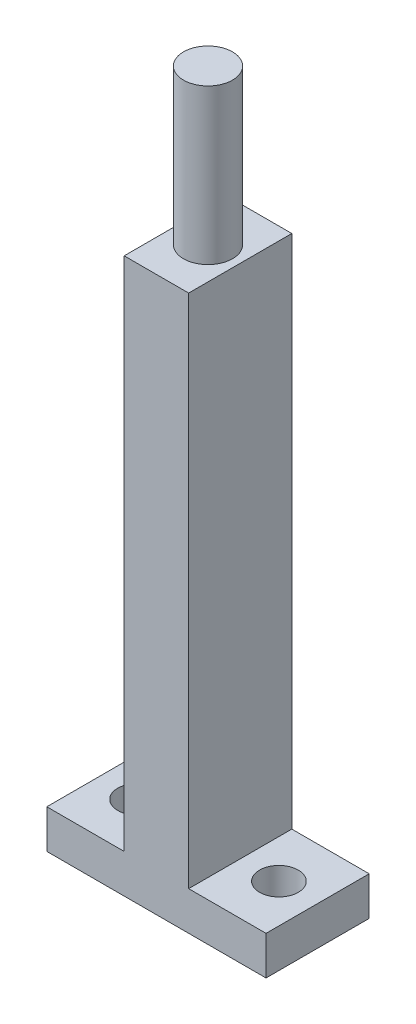
ISO-10303-21;
HEADER;
FILE_DESCRIPTION(('STEP AP214'),'2;1');
FILE_NAME('part.step','',(''),(''),'','','');
FILE_SCHEMA(('AUTOMOTIVE_DESIGN { 1 0 10303 214 1 1 1 1 }'));
ENDSEC;
DATA;
#1=APPLICATION_CONTEXT('core data for automotive mechanical design processes');
#2=APPLICATION_PROTOCOL_DEFINITION('international standard','automotive_design',2000,#1);
#3=PRODUCT_CONTEXT('',#1,'mechanical');
#4=PRODUCT('Part','Part','',(#3));
#5=PRODUCT_RELATED_PRODUCT_CATEGORY('part','',(#4));
#6=PRODUCT_DEFINITION_FORMATION('','',#4);
#7=PRODUCT_DEFINITION_CONTEXT('part definition',#1,'design');
#8=PRODUCT_DEFINITION('design','',#6,#7);
#9=PRODUCT_DEFINITION_SHAPE('','',#8);
#10=(LENGTH_UNIT() NAMED_UNIT(*) SI_UNIT(.MILLI.,.METRE.));
#11=(NAMED_UNIT(*) PLANE_ANGLE_UNIT() SI_UNIT($,.RADIAN.));
#12=(NAMED_UNIT(*) SI_UNIT($,.STERADIAN.) SOLID_ANGLE_UNIT());
#13=UNCERTAINTY_MEASURE_WITH_UNIT(LENGTH_MEASURE(1.E-05),#10,'distance_accuracy_value','');
#14=(GEOMETRIC_REPRESENTATION_CONTEXT(3) GLOBAL_UNCERTAINTY_ASSIGNED_CONTEXT((#13)) GLOBAL_UNIT_ASSIGNED_CONTEXT((#10,
#11,#12)) REPRESENTATION_CONTEXT('',''));
#15=CARTESIAN_POINT('',(0.,0.,0.));
#16=DIRECTION('',(0.,0.,1.));
#17=DIRECTION('',(1.,0.,0.));
#18=AXIS2_PLACEMENT_3D('',#15,#16,#17);
#19=CARTESIAN_POINT('',(0.,55.,0.));
#20=DIRECTION('',(0.,-1.,0.));
#21=DIRECTION('',(0.,0.,-1.));
#22=AXIS2_PLACEMENT_3D('',#19,#20,#21);
#23=CYLINDRICAL_SURFACE('',#22,1.9);
#24=CARTESIAN_POINT('',(0.,55.,0.));
#25=DIRECTION('',(0.,1.,0.));
#26=DIRECTION('',(0.,0.,1.));
#27=AXIS2_PLACEMENT_3D('',#24,#25,#26);
#28=CIRCLE('',#27,1.9);
#29=CARTESIAN_POINT('',(0.,55.,1.9));
#30=VERTEX_POINT('',#29);
#31=EDGE_CURVE('E40',#30,#30,#28,.T.);
#32=ORIENTED_EDGE('',*,*,#31,.F.);
#33=EDGE_LOOP('',(#32));
#34=FACE_BOUND('',#33,.T.);
#35=CARTESIAN_POINT('',(0.,43.,0.));
#36=DIRECTION('',(0.,-1.,0.));
#37=DIRECTION('',(0.,0.,-1.));
#38=AXIS2_PLACEMENT_3D('',#35,#36,#37);
#39=CIRCLE('',#38,1.9);
#40=CARTESIAN_POINT('',(0.,43.,-1.9));
#41=VERTEX_POINT('',#40);
#42=EDGE_CURVE('E11',#41,#41,#39,.T.);
#43=ORIENTED_EDGE('',*,*,#42,.F.);
#44=EDGE_LOOP('',(#43));
#45=FACE_BOUND('',#44,.T.);
#46=ADVANCED_FACE('F33',(#34,#45),#23,.T.);
#47=CARTESIAN_POINT('',(0.,55.,0.));
#48=DIRECTION('',(0.,1.,0.));
#49=DIRECTION('',(0.,0.,1.));
#50=AXIS2_PLACEMENT_3D('',#47,#48,#49);
#51=PLANE('',#50);
#52=ORIENTED_EDGE('',*,*,#31,.T.);
#53=EDGE_LOOP('',(#52));
#54=FACE_BOUND('',#53,.T.);
#55=ADVANCED_FACE('F173',(#54),#51,.T.);
#56=CARTESIAN_POINT('',(-2.5,43.,-4.));
#57=DIRECTION('',(1.,0.,0.));
#58=DIRECTION('',(0.,0.,-1.));
#59=AXIS2_PLACEMENT_3D('',#56,#57,#58);
#60=PLANE('',#59);
#61=DIRECTION('',(0.,0.,1.));
#62=VECTOR('',#61,1.);
#63=CARTESIAN_POINT('',(-2.5,3.,-4.));
#64=LINE('',#63,#62);
#65=CARTESIAN_POINT('',(-2.5,3.,-4.));
#66=VERTEX_POINT('',#65);
#67=CARTESIAN_POINT('',(-2.5,3.,4.));
#68=VERTEX_POINT('',#67);
#69=EDGE_CURVE('E127',#66,#68,#64,.T.);
#70=ORIENTED_EDGE('',*,*,#69,.T.);
#71=DIRECTION('',(0.,-1.,0.));
#72=VECTOR('',#71,1.);
#73=CARTESIAN_POINT('',(-2.5,43.,4.));
#74=LINE('',#73,#72);
#75=CARTESIAN_POINT('',(-2.5,43.,4.));
#76=VERTEX_POINT('',#75);
#77=EDGE_CURVE('E109',#76,#68,#74,.T.);
#78=ORIENTED_EDGE('',*,*,#77,.F.);
#79=DIRECTION('',(0.,0.,1.));
#80=VECTOR('',#79,1.);
#81=CARTESIAN_POINT('',(-2.5,43.,-4.));
#82=LINE('',#81,#80);
#83=CARTESIAN_POINT('',(-2.5,43.,-4.));
#84=VERTEX_POINT('',#83);
#85=EDGE_CURVE('E116',#84,#76,#82,.T.);
#86=ORIENTED_EDGE('',*,*,#85,.F.);
#87=DIRECTION('',(0.,-1.,0.));
#88=VECTOR('',#87,1.);
#89=CARTESIAN_POINT('',(-2.5,43.,-4.));
#90=LINE('',#89,#88);
#91=EDGE_CURVE('E233',#84,#66,#90,.T.);
#92=ORIENTED_EDGE('',*,*,#91,.T.);
#93=EDGE_LOOP('',(#70,#78,#86,#92));
#94=FACE_BOUND('',#93,.T.);
#95=ADVANCED_FACE('F125',(#94),#60,.F.);
#96=CARTESIAN_POINT('',(2.5,43.,-4.));
#97=DIRECTION('',(-1.,0.,0.));
#98=DIRECTION('',(0.,0.,1.));
#99=AXIS2_PLACEMENT_3D('',#96,#97,#98);
#100=PLANE('',#99);
#101=DIRECTION('',(0.,0.,-1.));
#102=VECTOR('',#101,1.);
#103=CARTESIAN_POINT('',(2.5,3.,-4.));
#104=LINE('',#103,#102);
#105=CARTESIAN_POINT('',(2.5,3.,4.));
#106=VERTEX_POINT('',#105);
#107=CARTESIAN_POINT('',(2.5,3.,-4.));
#108=VERTEX_POINT('',#107);
#109=EDGE_CURVE('E123',#106,#108,#104,.T.);
#110=ORIENTED_EDGE('',*,*,#109,.T.);
#111=DIRECTION('',(0.,-1.,0.));
#112=VECTOR('',#111,1.);
#113=CARTESIAN_POINT('',(2.5,43.,-4.));
#114=LINE('',#113,#112);
#115=CARTESIAN_POINT('',(2.5,43.,-4.));
#116=VERTEX_POINT('',#115);
#117=EDGE_CURVE('E47',#116,#108,#114,.T.);
#118=ORIENTED_EDGE('',*,*,#117,.F.);
#119=DIRECTION('',(0.,0.,-1.));
#120=VECTOR('',#119,1.);
#121=CARTESIAN_POINT('',(2.5,43.,-4.));
#122=LINE('',#121,#120);
#123=CARTESIAN_POINT('',(2.5,43.,4.));
#124=VERTEX_POINT('',#123);
#125=EDGE_CURVE('E115',#124,#116,#122,.T.);
#126=ORIENTED_EDGE('',*,*,#125,.F.);
#127=DIRECTION('',(0.,-1.,0.));
#128=VECTOR('',#127,1.);
#129=CARTESIAN_POINT('',(2.5,43.,4.));
#130=LINE('',#129,#128);
#131=EDGE_CURVE('E112',#124,#106,#130,.T.);
#132=ORIENTED_EDGE('',*,*,#131,.T.);
#133=EDGE_LOOP('',(#110,#118,#126,#132));
#134=FACE_BOUND('',#133,.T.);
#135=ADVANCED_FACE('F181',(#134),#100,.F.);
#136=CARTESIAN_POINT('',(0.,43.,0.));
#137=DIRECTION('',(0.,-1.,0.));
#138=DIRECTION('',(0.,0.,-1.));
#139=AXIS2_PLACEMENT_3D('',#136,#137,#138);
#140=PLANE('',#139);
#141=ORIENTED_EDGE('',*,*,#42,.T.);
#142=EDGE_LOOP('',(#141));
#143=FACE_BOUND('',#142,.T.);
#144=ORIENTED_EDGE('',*,*,#85,.T.);
#145=DIRECTION('',(1.,0.,0.));
#146=VECTOR('',#145,1.);
#147=CARTESIAN_POINT('',(2.5,43.,4.));
#148=LINE('',#147,#146);
#149=EDGE_CURVE('E104',#76,#124,#148,.T.);
#150=ORIENTED_EDGE('',*,*,#149,.T.);
#151=ORIENTED_EDGE('',*,*,#125,.T.);
#152=DIRECTION('',(-1.,0.,0.));
#153=VECTOR('',#152,1.);
#154=CARTESIAN_POINT('',(2.5,43.,-4.));
#155=LINE('',#154,#153);
#156=EDGE_CURVE('E120',#116,#84,#155,.T.);
#157=ORIENTED_EDGE('',*,*,#156,.T.);
#158=EDGE_LOOP('',(#144,#150,#151,#157));
#159=FACE_BOUND('',#158,.T.);
#160=ADVANCED_FACE('F119',(#143,#159),#140,.F.);
#161=CARTESIAN_POINT('',(-5.5,0.,0.));
#162=DIRECTION('',(0.,1.,0.));
#163=DIRECTION('',(0.,0.,1.));
#164=AXIS2_PLACEMENT_3D('',#161,#162,#163);
#165=CYLINDRICAL_SURFACE('',#164,1.5);
#166=CARTESIAN_POINT('',(-5.5,0.,0.));
#167=DIRECTION('',(0.,1.,0.));
#168=DIRECTION('',(0.,0.,1.));
#169=AXIS2_PLACEMENT_3D('',#166,#167,#168);
#170=CIRCLE('',#169,1.5);
#171=CARTESIAN_POINT('',(-5.5,0.,1.5));
#172=VERTEX_POINT('',#171);
#173=EDGE_CURVE('E136',#172,#172,#170,.T.);
#174=ORIENTED_EDGE('',*,*,#173,.F.);
#175=EDGE_LOOP('',(#174));
#176=FACE_BOUND('',#175,.T.);
#177=CARTESIAN_POINT('',(-5.5,3.,0.));
#178=DIRECTION('',(0.,1.,0.));
#179=DIRECTION('',(0.,0.,1.));
#180=AXIS2_PLACEMENT_3D('',#177,#178,#179);
#181=CIRCLE('',#180,1.5);
#182=CARTESIAN_POINT('',(-5.5,3.,1.5));
#183=VERTEX_POINT('',#182);
#184=EDGE_CURVE('E140',#183,#183,#181,.T.);
#185=ORIENTED_EDGE('',*,*,#184,.T.);
#186=EDGE_LOOP('',(#185));
#187=FACE_BOUND('',#186,.T.);
#188=ADVANCED_FACE('F180',(#176,#187),#165,.F.);
#189=CARTESIAN_POINT('',(5.5,0.,0.));
#190=DIRECTION('',(0.,1.,0.));
#191=DIRECTION('',(0.,0.,1.));
#192=AXIS2_PLACEMENT_3D('',#189,#190,#191);
#193=CYLINDRICAL_SURFACE('',#192,1.5);
#194=CARTESIAN_POINT('',(5.5,0.,0.));
#195=DIRECTION('',(0.,1.,0.));
#196=DIRECTION('',(0.,0.,-1.));
#197=AXIS2_PLACEMENT_3D('',#194,#195,#196);
#198=CIRCLE('',#197,1.5);
#199=CARTESIAN_POINT('',(5.5,0.,-1.5));
#200=VERTEX_POINT('',#199);
#201=EDGE_CURVE('E131',#200,#200,#198,.T.);
#202=ORIENTED_EDGE('',*,*,#201,.F.);
#203=EDGE_LOOP('',(#202));
#204=FACE_BOUND('',#203,.T.);
#205=CARTESIAN_POINT('',(5.5,3.,0.));
#206=DIRECTION('',(0.,1.,0.));
#207=DIRECTION('',(0.,0.,-1.));
#208=AXIS2_PLACEMENT_3D('',#205,#206,#207);
#209=CIRCLE('',#208,1.5);
#210=CARTESIAN_POINT('',(5.5,3.,-1.5));
#211=VERTEX_POINT('',#210);
#212=EDGE_CURVE('E128',#211,#211,#209,.T.);
#213=ORIENTED_EDGE('',*,*,#212,.T.);
#214=EDGE_LOOP('',(#213));
#215=FACE_BOUND('',#214,.T.);
#216=ADVANCED_FACE('F187',(#204,#215),#193,.F.);
#217=CARTESIAN_POINT('',(8.5,3.,-4.));
#218=DIRECTION('',(1.,0.,0.));
#219=DIRECTION('',(0.,0.,-1.));
#220=AXIS2_PLACEMENT_3D('',#217,#218,#219);
#221=PLANE('',#220);
#222=DIRECTION('',(0.,0.,1.));
#223=VECTOR('',#222,1.);
#224=CARTESIAN_POINT('',(8.5,0.,-4.));
#225=LINE('',#224,#223);
#226=CARTESIAN_POINT('',(8.5,0.,-4.));
#227=VERTEX_POINT('',#226);
#228=CARTESIAN_POINT('',(8.5,0.,4.));
#229=VERTEX_POINT('',#228);
#230=EDGE_CURVE('E159',#227,#229,#225,.T.);
#231=ORIENTED_EDGE('',*,*,#230,.F.);
#232=DIRECTION('',(0.,-1.,0.));
#233=VECTOR('',#232,1.);
#234=CARTESIAN_POINT('',(8.5,3.,-4.));
#235=LINE('',#234,#233);
#236=CARTESIAN_POINT('',(8.5,3.,-4.));
#237=VERTEX_POINT('',#236);
#238=EDGE_CURVE('E165',#237,#227,#235,.T.);
#239=ORIENTED_EDGE('',*,*,#238,.F.);
#240=DIRECTION('',(0.,0.,1.));
#241=VECTOR('',#240,1.);
#242=CARTESIAN_POINT('',(8.5,3.,-4.));
#243=LINE('',#242,#241);
#244=CARTESIAN_POINT('',(8.5,3.,4.));
#245=VERTEX_POINT('',#244);
#246=EDGE_CURVE('E150',#237,#245,#243,.T.);
#247=ORIENTED_EDGE('',*,*,#246,.T.);
#248=DIRECTION('',(0.,-1.,0.));
#249=VECTOR('',#248,1.);
#250=CARTESIAN_POINT('',(8.5,3.,4.));
#251=LINE('',#250,#249);
#252=EDGE_CURVE('E167',#245,#229,#251,.T.);
#253=ORIENTED_EDGE('',*,*,#252,.T.);
#254=EDGE_LOOP('',(#231,#239,#247,#253));
#255=FACE_BOUND('',#254,.T.);
#256=ADVANCED_FACE('F197',(#255),#221,.T.);
#257=CARTESIAN_POINT('',(-8.5,3.,-4.));
#258=DIRECTION('',(1.,0.,0.));
#259=DIRECTION('',(0.,0.,-1.));
#260=AXIS2_PLACEMENT_3D('',#257,#258,#259);
#261=PLANE('',#260);
#262=DIRECTION('',(0.,0.,1.));
#263=VECTOR('',#262,1.);
#264=CARTESIAN_POINT('',(-8.5,0.,-4.));
#265=LINE('',#264,#263);
#266=CARTESIAN_POINT('',(-8.5,0.,-4.));
#267=VERTEX_POINT('',#266);
#268=CARTESIAN_POINT('',(-8.5,0.,4.));
#269=VERTEX_POINT('',#268);
#270=EDGE_CURVE('E139',#267,#269,#265,.T.);
#271=ORIENTED_EDGE('',*,*,#270,.T.);
#272=DIRECTION('',(0.,-1.,0.));
#273=VECTOR('',#272,1.);
#274=CARTESIAN_POINT('',(-8.5,3.,4.));
#275=LINE('',#274,#273);
#276=CARTESIAN_POINT('',(-8.5,3.,4.));
#277=VERTEX_POINT('',#276);
#278=EDGE_CURVE('E169',#277,#269,#275,.T.);
#279=ORIENTED_EDGE('',*,*,#278,.F.);
#280=DIRECTION('',(0.,0.,1.));
#281=VECTOR('',#280,1.);
#282=CARTESIAN_POINT('',(-8.5,3.,-4.));
#283=LINE('',#282,#281);
#284=CARTESIAN_POINT('',(-8.5,3.,-4.));
#285=VERTEX_POINT('',#284);
#286=EDGE_CURVE('E145',#285,#277,#283,.T.);
#287=ORIENTED_EDGE('',*,*,#286,.F.);
#288=DIRECTION('',(0.,-1.,0.));
#289=VECTOR('',#288,1.);
#290=CARTESIAN_POINT('',(-8.5,3.,-4.));
#291=LINE('',#290,#289);
#292=EDGE_CURVE('E55',#285,#267,#291,.T.);
#293=ORIENTED_EDGE('',*,*,#292,.T.);
#294=EDGE_LOOP('',(#271,#279,#287,#293));
#295=FACE_BOUND('',#294,.T.);
#296=ADVANCED_FACE('F210',(#295),#261,.F.);
#297=CARTESIAN_POINT('',(0.,0.,0.));
#298=DIRECTION('',(0.,1.,0.));
#299=DIRECTION('',(0.,0.,1.));
#300=AXIS2_PLACEMENT_3D('',#297,#298,#299);
#301=PLANE('',#300);
#302=ORIENTED_EDGE('',*,*,#173,.T.);
#303=EDGE_LOOP('',(#302));
#304=FACE_BOUND('',#303,.T.);
#305=ORIENTED_EDGE('',*,*,#201,.T.);
#306=EDGE_LOOP('',(#305));
#307=FACE_BOUND('',#306,.T.);
#308=ORIENTED_EDGE('',*,*,#270,.F.);
#309=DIRECTION('',(1.,0.,0.));
#310=VECTOR('',#309,1.);
#311=CARTESIAN_POINT('',(-8.5,0.,-4.));
#312=LINE('',#311,#310);
#313=EDGE_CURVE('E148',#267,#227,#312,.T.);
#314=ORIENTED_EDGE('',*,*,#313,.T.);
#315=ORIENTED_EDGE('',*,*,#230,.T.);
#316=DIRECTION('',(1.,0.,0.));
#317=VECTOR('',#316,1.);
#318=CARTESIAN_POINT('',(-8.5,0.,4.));
#319=LINE('',#318,#317);
#320=EDGE_CURVE('E157',#269,#229,#319,.T.);
#321=ORIENTED_EDGE('',*,*,#320,.F.);
#322=EDGE_LOOP('',(#308,#314,#315,#321));
#323=FACE_BOUND('',#322,.T.);
#324=ADVANCED_FACE('F207',(#304,#307,#323),#301,.F.);
#325=CARTESIAN_POINT('',(-8.5,3.,-4.));
#326=DIRECTION('',(0.,0.,-1.));
#327=DIRECTION('',(-1.,0.,0.));
#328=AXIS2_PLACEMENT_3D('',#325,#326,#327);
#329=PLANE('',#328);
#330=ORIENTED_EDGE('',*,*,#313,.F.);
#331=ORIENTED_EDGE('',*,*,#292,.F.);
#332=DIRECTION('',(1.,0.,0.));
#333=VECTOR('',#332,1.);
#334=CARTESIAN_POINT('',(-8.5,3.,-4.));
#335=LINE('',#334,#333);
#336=EDGE_CURVE('E154',#285,#66,#335,.T.);
#337=ORIENTED_EDGE('',*,*,#336,.T.);
#338=ORIENTED_EDGE('',*,*,#91,.F.);
#339=ORIENTED_EDGE('',*,*,#156,.F.);
#340=ORIENTED_EDGE('',*,*,#117,.T.);
#341=EDGE_CURVE('E153',#108,#237,#335,.T.);
#342=ORIENTED_EDGE('',*,*,#341,.T.);
#343=ORIENTED_EDGE('',*,*,#238,.T.);
#344=EDGE_LOOP('',(#330,#331,#337,#338,#339,#340,#342,#343));
#345=FACE_BOUND('',#344,.T.);
#346=ADVANCED_FACE('F204',(#345),#329,.T.);
#347=CARTESIAN_POINT('',(0.,3.,0.));
#348=DIRECTION('',(0.,1.,0.));
#349=DIRECTION('',(0.,0.,1.));
#350=AXIS2_PLACEMENT_3D('',#347,#348,#349);
#351=PLANE('',#350);
#352=ORIENTED_EDGE('',*,*,#212,.F.);
#353=EDGE_LOOP('',(#352));
#354=FACE_BOUND('',#353,.T.);
#355=ORIENTED_EDGE('',*,*,#341,.F.);
#356=ORIENTED_EDGE('',*,*,#109,.F.);
#357=DIRECTION('',(1.,0.,0.));
#358=VECTOR('',#357,1.);
#359=CARTESIAN_POINT('',(-8.5,3.,4.));
#360=LINE('',#359,#358);
#361=EDGE_CURVE('E147',#106,#245,#360,.T.);
#362=ORIENTED_EDGE('',*,*,#361,.T.);
#363=ORIENTED_EDGE('',*,*,#246,.F.);
#364=EDGE_LOOP('',(#355,#356,#362,#363));
#365=FACE_BOUND('',#364,.T.);
#366=ADVANCED_FACE('F203',(#354,#365),#351,.T.);
#367=CARTESIAN_POINT('',(-8.5,3.,4.));
#368=DIRECTION('',(0.,0.,-1.));
#369=DIRECTION('',(-1.,0.,0.));
#370=AXIS2_PLACEMENT_3D('',#367,#368,#369);
#371=PLANE('',#370);
#372=ORIENTED_EDGE('',*,*,#320,.T.);
#373=ORIENTED_EDGE('',*,*,#252,.F.);
#374=ORIENTED_EDGE('',*,*,#361,.F.);
#375=ORIENTED_EDGE('',*,*,#131,.F.);
#376=ORIENTED_EDGE('',*,*,#149,.F.);
#377=ORIENTED_EDGE('',*,*,#77,.T.);
#378=EDGE_CURVE('E81',#277,#68,#360,.T.);
#379=ORIENTED_EDGE('',*,*,#378,.F.);
#380=ORIENTED_EDGE('',*,*,#278,.T.);
#381=EDGE_LOOP('',(#372,#373,#374,#375,#376,#377,#379,#380));
#382=FACE_BOUND('',#381,.T.);
#383=ADVANCED_FACE('F107',(#382),#371,.F.);
#384=ORIENTED_EDGE('',*,*,#184,.F.);
#385=EDGE_LOOP('',(#384));
#386=FACE_BOUND('',#385,.T.);
#387=ORIENTED_EDGE('',*,*,#378,.T.);
#388=ORIENTED_EDGE('',*,*,#69,.F.);
#389=ORIENTED_EDGE('',*,*,#336,.F.);
#390=ORIENTED_EDGE('',*,*,#286,.T.);
#391=EDGE_LOOP('',(#387,#388,#389,#390));
#392=FACE_BOUND('',#391,.T.);
#393=ADVANCED_FACE('F199',(#386,#392),#351,.T.);
#394=CLOSED_SHELL('',(#46,#55,#95,#135,#160,#188,#216,#256,#296,#324,#346,#366,#383,#393));
#395=MANIFOLD_SOLID_BREP('B2',#394);
#396=ADVANCED_BREP_SHAPE_REPRESENTATION('',(#18,#395),#14);
#397=SHAPE_DEFINITION_REPRESENTATION(#9,#396);
ENDSEC;
END-ISO-10303-21;
